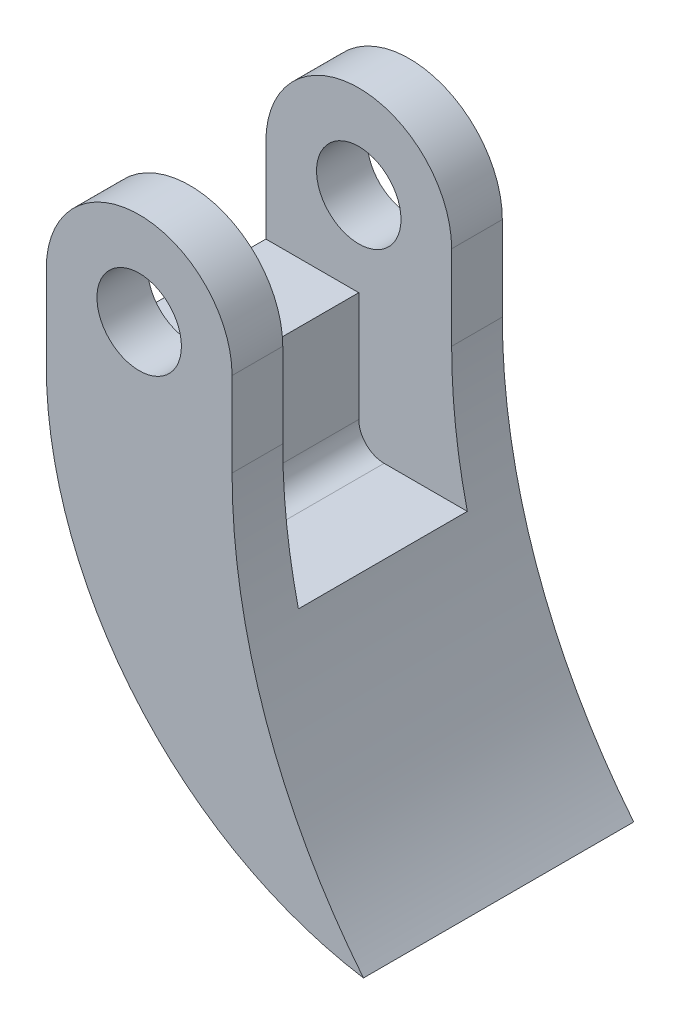
ISO-10303-21;
HEADER;
FILE_DESCRIPTION(('STEP AP214'),'2;1');
FILE_NAME('part.step','',(''),(''),'','','');
FILE_SCHEMA(('AUTOMOTIVE_DESIGN { 1 0 10303 214 1 1 1 1 }'));
ENDSEC;
DATA;
#1=APPLICATION_CONTEXT('core data for automotive mechanical design processes');
#2=APPLICATION_PROTOCOL_DEFINITION('international standard','automotive_design',2000,#1);
#3=PRODUCT_CONTEXT('',#1,'mechanical');
#4=PRODUCT('Part','Part','',(#3));
#5=PRODUCT_RELATED_PRODUCT_CATEGORY('part','',(#4));
#6=PRODUCT_DEFINITION_FORMATION('','',#4);
#7=PRODUCT_DEFINITION_CONTEXT('part definition',#1,'design');
#8=PRODUCT_DEFINITION('design','',#6,#7);
#9=PRODUCT_DEFINITION_SHAPE('','',#8);
#10=(LENGTH_UNIT() NAMED_UNIT(*) SI_UNIT(.MILLI.,.METRE.));
#11=(NAMED_UNIT(*) PLANE_ANGLE_UNIT() SI_UNIT($,.RADIAN.));
#12=(NAMED_UNIT(*) SI_UNIT($,.STERADIAN.) SOLID_ANGLE_UNIT());
#13=UNCERTAINTY_MEASURE_WITH_UNIT(LENGTH_MEASURE(1.E-05),#10,'distance_accuracy_value','');
#14=(GEOMETRIC_REPRESENTATION_CONTEXT(3) GLOBAL_UNCERTAINTY_ASSIGNED_CONTEXT((#13)) GLOBAL_UNIT_ASSIGNED_CONTEXT((#10,
#11,#12)) REPRESENTATION_CONTEXT('',''));
#15=CARTESIAN_POINT('',(0.,0.,0.));
#16=DIRECTION('',(0.,0.,1.));
#17=DIRECTION('',(1.,0.,0.));
#18=AXIS2_PLACEMENT_3D('',#15,#16,#17);
#19=CARTESIAN_POINT('',(1.33852066397794,67.0602,16.));
#20=DIRECTION('',(0.,0.,-1.));
#21=DIRECTION('',(-1.,0.,0.));
#22=AXIS2_PLACEMENT_3D('',#19,#20,#21);
#23=CYLINDRICAL_SURFACE('',#22,5.5);
#24=CARTESIAN_POINT('',(1.33852066397794,67.0602,3.));
#25=DIRECTION('',(0.,0.,-1.));
#26=DIRECTION('',(0.,1.,0.));
#27=AXIS2_PLACEMENT_3D('',#24,#25,#26);
#28=CIRCLE('',#27,5.5);
#29=CARTESIAN_POINT('',(-4.16147933602205,67.0602,3.));
#30=VERTEX_POINT('',#29);
#31=CARTESIAN_POINT('',(6.83852066397794,67.0602,3.));
#32=VERTEX_POINT('',#31);
#33=EDGE_CURVE('E164',#30,#32,#28,.T.);
#34=ORIENTED_EDGE('',*,*,#33,.T.);
#35=DIRECTION('',(0.,0.,-1.));
#36=VECTOR('',#35,1.);
#37=CARTESIAN_POINT('',(6.83852066397794,67.0602,16.));
#38=LINE('',#37,#36);
#39=CARTESIAN_POINT('',(6.83852066397794,67.0602,0.));
#40=VERTEX_POINT('',#39);
#41=EDGE_CURVE('E188',#32,#40,#38,.T.);
#42=ORIENTED_EDGE('',*,*,#41,.T.);
#43=CARTESIAN_POINT('',(1.33852066397794,67.0602,0.));
#44=DIRECTION('',(0.,0.,1.));
#45=DIRECTION('',(-1.,0.,0.));
#46=AXIS2_PLACEMENT_3D('',#43,#44,#45);
#47=CIRCLE('',#46,5.5);
#48=CARTESIAN_POINT('',(-4.16147933602205,67.0602,0.));
#49=VERTEX_POINT('',#48);
#50=EDGE_CURVE('E173',#40,#49,#47,.T.);
#51=ORIENTED_EDGE('',*,*,#50,.T.);
#52=DIRECTION('',(0.,0.,-1.));
#53=VECTOR('',#52,1.);
#54=CARTESIAN_POINT('',(-4.16147933602205,67.0602,16.));
#55=LINE('',#54,#53);
#56=EDGE_CURVE('E215',#30,#49,#55,.T.);
#57=ORIENTED_EDGE('',*,*,#56,.F.);
#58=EDGE_LOOP('',(#34,#42,#51,#57));
#59=FACE_BOUND('',#58,.T.);
#60=ADVANCED_FACE('F34',(#59),#23,.T.);
#61=CARTESIAN_POINT('',(-4.16147933602205,67.0602,16.));
#62=DIRECTION('',(1.,0.,0.));
#63=DIRECTION('',(0.,1.,0.));
#64=AXIS2_PLACEMENT_3D('',#61,#62,#63);
#65=PLANE('',#64);
#66=DIRECTION('',(0.,0.,-1.));
#67=VECTOR('',#66,1.);
#68=CARTESIAN_POINT('',(-4.16147933602205,62.0602,16.));
#69=LINE('',#68,#67);
#70=CARTESIAN_POINT('',(-4.16147933602205,62.0602000000007,3.));
#71=VERTEX_POINT('',#70);
#72=CARTESIAN_POINT('',(-4.16147933602205,62.0602,0.));
#73=VERTEX_POINT('',#72);
#74=EDGE_CURVE('E211',#71,#73,#69,.T.);
#75=ORIENTED_EDGE('',*,*,#74,.F.);
#76=DIRECTION('',(0.,1.,0.));
#77=VECTOR('',#76,1.);
#78=CARTESIAN_POINT('',(-4.16147933602205,67.0602,3.));
#79=LINE('',#78,#77);
#80=EDGE_CURVE('E147',#71,#30,#79,.T.);
#81=ORIENTED_EDGE('',*,*,#80,.T.);
#82=ORIENTED_EDGE('',*,*,#56,.T.);
#83=DIRECTION('',(0.,-1.,0.));
#84=VECTOR('',#83,1.);
#85=CARTESIAN_POINT('',(-4.16147933602205,67.0602,0.));
#86=LINE('',#85,#84);
#87=EDGE_CURVE('E191',#49,#73,#86,.T.);
#88=ORIENTED_EDGE('',*,*,#87,.T.);
#89=EDGE_LOOP('',(#75,#81,#82,#88));
#90=FACE_BOUND('',#89,.T.);
#91=ADVANCED_FACE('F258',(#90),#65,.F.);
#92=CARTESIAN_POINT('',(6.83852066397794,67.0602,16.));
#93=DIRECTION('',(-1.,0.,0.));
#94=DIRECTION('',(0.,-1.,0.));
#95=AXIS2_PLACEMENT_3D('',#92,#93,#94);
#96=PLANE('',#95);
#97=ORIENTED_EDGE('',*,*,#41,.F.);
#98=DIRECTION('',(0.,1.,0.));
#99=VECTOR('',#98,1.);
#100=CARTESIAN_POINT('',(6.83852066397795,62.0602000000007,3.));
#101=LINE('',#100,#99);
#102=CARTESIAN_POINT('',(6.83852066397794,62.0602000000007,3.));
#103=VERTEX_POINT('',#102);
#104=EDGE_CURVE('E153',#103,#32,#101,.T.);
#105=ORIENTED_EDGE('',*,*,#104,.F.);
#106=DIRECTION('',(0.,0.,-1.));
#107=VECTOR('',#106,1.);
#108=CARTESIAN_POINT('',(6.83852066397794,62.0602,16.));
#109=LINE('',#108,#107);
#110=CARTESIAN_POINT('',(6.83852066397794,62.0602,0.));
#111=VERTEX_POINT('',#110);
#112=EDGE_CURVE('E204',#103,#111,#109,.T.);
#113=ORIENTED_EDGE('',*,*,#112,.T.);
#114=DIRECTION('',(0.,1.,0.));
#115=VECTOR('',#114,1.);
#116=CARTESIAN_POINT('',(6.83852066397794,67.0602,0.));
#117=LINE('',#116,#115);
#118=EDGE_CURVE('E180',#111,#40,#117,.T.);
#119=ORIENTED_EDGE('',*,*,#118,.T.);
#120=EDGE_LOOP('',(#97,#105,#113,#119));
#121=FACE_BOUND('',#120,.T.);
#122=ADVANCED_FACE('F251',(#121),#96,.F.);
#123=CARTESIAN_POINT('',(1.33852066397794,67.0602,0.));
#124=DIRECTION('',(0.,0.,1.));
#125=DIRECTION('',(1.,0.,0.));
#126=AXIS2_PLACEMENT_3D('',#123,#124,#125);
#127=CYLINDRICAL_SURFACE('',#126,2.5);
#128=CARTESIAN_POINT('',(1.33852066397794,67.0602,3.));
#129=DIRECTION('',(0.,0.,-1.));
#130=DIRECTION('',(0.,1.,0.));
#131=AXIS2_PLACEMENT_3D('',#128,#129,#130);
#132=CIRCLE('',#131,2.5);
#133=CARTESIAN_POINT('',(1.33852066397794,69.5602,3.));
#134=VERTEX_POINT('',#133);
#135=EDGE_CURVE('E162',#134,#134,#132,.F.);
#136=ORIENTED_EDGE('',*,*,#135,.T.);
#137=EDGE_LOOP('',(#136));
#138=FACE_BOUND('',#137,.T.);
#139=CARTESIAN_POINT('',(1.33852066397794,67.0602,0.));
#140=DIRECTION('',(0.,0.,1.));
#141=DIRECTION('',(1.,0.,0.));
#142=AXIS2_PLACEMENT_3D('',#139,#140,#141);
#143=CIRCLE('',#142,2.5);
#144=CARTESIAN_POINT('',(3.83852066397795,67.0602,0.));
#145=VERTEX_POINT('',#144);
#146=EDGE_CURVE('E170',#145,#145,#143,.T.);
#147=ORIENTED_EDGE('',*,*,#146,.F.);
#148=EDGE_LOOP('',(#147));
#149=FACE_BOUND('',#148,.T.);
#150=ADVANCED_FACE('F292',(#138,#149),#127,.F.);
#151=CARTESIAN_POINT('',(6.83852066397794,67.0602,16.));
#152=VERTEX_POINT('',#151);
#153=CARTESIAN_POINT('',(6.83852066397794,67.0602,13.));
#154=VERTEX_POINT('',#153);
#155=EDGE_CURVE('E201',#152,#154,#38,.T.);
#156=ORIENTED_EDGE('',*,*,#155,.T.);
#157=CARTESIAN_POINT('',(1.33852066397794,67.0602,13.));
#158=DIRECTION('',(0.,0.,1.));
#159=DIRECTION('',(0.,-1.,0.));
#160=AXIS2_PLACEMENT_3D('',#157,#158,#159);
#161=CIRCLE('',#160,5.5);
#162=CARTESIAN_POINT('',(-4.16147933602205,67.0602,13.));
#163=VERTEX_POINT('',#162);
#164=EDGE_CURVE('E160',#154,#163,#161,.T.);
#165=ORIENTED_EDGE('',*,*,#164,.T.);
#166=CARTESIAN_POINT('',(-4.16147933602205,67.0602,16.));
#167=VERTEX_POINT('',#166);
#168=EDGE_CURVE('E216',#167,#163,#55,.T.);
#169=ORIENTED_EDGE('',*,*,#168,.F.);
#170=CARTESIAN_POINT('',(1.33852066397794,67.0602,16.));
#171=DIRECTION('',(0.,0.,1.));
#172=DIRECTION('',(-1.,0.,0.));
#173=AXIS2_PLACEMENT_3D('',#170,#171,#172);
#174=CIRCLE('',#173,5.5);
#175=EDGE_CURVE('E176',#152,#167,#174,.T.);
#176=ORIENTED_EDGE('',*,*,#175,.F.);
#177=EDGE_LOOP('',(#156,#165,#169,#176));
#178=FACE_BOUND('',#177,.T.);
#179=ADVANCED_FACE('F286',(#178),#23,.T.);
#180=ORIENTED_EDGE('',*,*,#168,.T.);
#181=DIRECTION('',(0.,-1.,0.));
#182=VECTOR('',#181,1.);
#183=CARTESIAN_POINT('',(-4.16147933602205,67.0602,13.));
#184=LINE('',#183,#182);
#185=CARTESIAN_POINT('',(-4.16147933602205,62.0602000000007,13.));
#186=VERTEX_POINT('',#185);
#187=EDGE_CURVE('E151',#163,#186,#184,.T.);
#188=ORIENTED_EDGE('',*,*,#187,.T.);
#189=CARTESIAN_POINT('',(-4.16147933602205,62.0602,16.));
#190=VERTEX_POINT('',#189);
#191=EDGE_CURVE('E212',#190,#186,#69,.T.);
#192=ORIENTED_EDGE('',*,*,#191,.F.);
#193=DIRECTION('',(0.,-1.,0.));
#194=VECTOR('',#193,1.);
#195=CARTESIAN_POINT('',(-4.16147933602205,67.0602,16.));
#196=LINE('',#195,#194);
#197=EDGE_CURVE('E179',#167,#190,#196,.T.);
#198=ORIENTED_EDGE('',*,*,#197,.F.);
#199=EDGE_LOOP('',(#180,#188,#192,#198));
#200=FACE_BOUND('',#199,.T.);
#201=ADVANCED_FACE('F277',(#200),#65,.F.);
#202=CARTESIAN_POINT('',(18.114814546425,62.0602,16.));
#203=DIRECTION('',(0.,0.,-1.));
#204=DIRECTION('',(-1.,0.,0.));
#205=AXIS2_PLACEMENT_3D('',#202,#203,#204);
#206=CYLINDRICAL_SURFACE('',#205,22.2762938824471);
#207=CARTESIAN_POINT('',(18.114814546425,62.0602,0.));
#208=DIRECTION('',(0.,0.,1.));
#209=DIRECTION('',(1.,0.,0.));
#210=AXIS2_PLACEMENT_3D('',#207,#208,#209);
#211=CIRCLE('',#210,22.2762938824471);
#212=CARTESIAN_POINT('',(14.6172054863455,40.0602,0.));
#213=VERTEX_POINT('',#212);
#214=EDGE_CURVE('E194',#73,#213,#211,.T.);
#215=ORIENTED_EDGE('',*,*,#214,.T.);
#216=DIRECTION('',(0.,0.,-1.));
#217=VECTOR('',#216,1.);
#218=CARTESIAN_POINT('',(14.6172054863455,40.0602,16.));
#219=LINE('',#218,#217);
#220=CARTESIAN_POINT('',(14.6172054863455,40.0602,16.));
#221=VERTEX_POINT('',#220);
#222=EDGE_CURVE('E208',#221,#213,#219,.T.);
#223=ORIENTED_EDGE('',*,*,#222,.F.);
#224=CARTESIAN_POINT('',(18.114814546425,62.0602,16.));
#225=DIRECTION('',(0.,0.,1.));
#226=DIRECTION('',(1.,0.,0.));
#227=AXIS2_PLACEMENT_3D('',#224,#225,#226);
#228=CIRCLE('',#227,22.2762938824471);
#229=EDGE_CURVE('E182',#190,#221,#228,.T.);
#230=ORIENTED_EDGE('',*,*,#229,.F.);
#231=ORIENTED_EDGE('',*,*,#191,.T.);
#232=DIRECTION('',(0.,0.,-1.));
#233=VECTOR('',#232,1.);
#234=CARTESIAN_POINT('',(-4.16147933602205,62.0602000000007,16.));
#235=LINE('',#234,#233);
#236=EDGE_CURVE('E166',#186,#71,#235,.T.);
#237=ORIENTED_EDGE('',*,*,#236,.T.);
#238=ORIENTED_EDGE('',*,*,#74,.T.);
#239=EDGE_LOOP('',(#215,#223,#230,#231,#237,#238));
#240=FACE_BOUND('',#239,.T.);
#241=ADVANCED_FACE('F265',(#240),#206,.T.);
#242=CARTESIAN_POINT('',(41.8385206639779,62.0602,16.));
#243=DIRECTION('',(0.,0.,-1.));
#244=DIRECTION('',(-1.,0.,0.));
#245=AXIS2_PLACEMENT_3D('',#242,#243,#244);
#246=CYLINDRICAL_SURFACE('',#245,35.);
#247=DIRECTION('',(0.,0.,-1.));
#248=VECTOR('',#247,1.);
#249=CARTESIAN_POINT('',(7.76507058917614,54.0602000000007,16.));
#250=LINE('',#249,#248);
#251=CARTESIAN_POINT('',(7.76507058917614,54.0602000000007,3.));
#252=VERTEX_POINT('',#251);
#253=CARTESIAN_POINT('',(7.76507058917614,54.0602000000007,13.));
#254=VERTEX_POINT('',#253);
#255=EDGE_CURVE('E218',#252,#254,#250,.F.);
#256=ORIENTED_EDGE('',*,*,#255,.T.);
#257=CARTESIAN_POINT('',(41.8385206639779,62.0602,13.));
#258=DIRECTION('',(0.,0.,1.));
#259=DIRECTION('',(1.,0.,0.));
#260=AXIS2_PLACEMENT_3D('',#257,#258,#259);
#261=CIRCLE('',#260,35.);
#262=CARTESIAN_POINT('',(6.83852066397794,62.0602000000007,13.));
#263=VERTEX_POINT('',#262);
#264=EDGE_CURVE('E236',#254,#263,#261,.F.);
#265=ORIENTED_EDGE('',*,*,#264,.T.);
#266=CARTESIAN_POINT('',(6.83852066397794,62.0602,16.));
#267=VERTEX_POINT('',#266);
#268=EDGE_CURVE('E205',#267,#263,#109,.T.);
#269=ORIENTED_EDGE('',*,*,#268,.F.);
#270=CARTESIAN_POINT('',(41.8385206639779,62.0602,16.));
#271=DIRECTION('',(0.,0.,-1.));
#272=DIRECTION('',(1.,0.,0.));
#273=AXIS2_PLACEMENT_3D('',#270,#271,#272);
#274=CIRCLE('',#273,35.);
#275=EDGE_CURVE('E184',#221,#267,#274,.T.);
#276=ORIENTED_EDGE('',*,*,#275,.F.);
#277=ORIENTED_EDGE('',*,*,#222,.T.);
#278=CARTESIAN_POINT('',(41.8385206639779,62.0602,0.));
#279=DIRECTION('',(0.,0.,-1.));
#280=DIRECTION('',(1.,0.,0.));
#281=AXIS2_PLACEMENT_3D('',#278,#279,#280);
#282=CIRCLE('',#281,35.);
#283=EDGE_CURVE('E196',#213,#111,#282,.T.);
#284=ORIENTED_EDGE('',*,*,#283,.T.);
#285=ORIENTED_EDGE('',*,*,#112,.F.);
#286=CARTESIAN_POINT('',(41.8385206639779,62.0602,3.));
#287=DIRECTION('',(0.,0.,-1.));
#288=DIRECTION('',(-1.,0.,0.));
#289=AXIS2_PLACEMENT_3D('',#286,#287,#288);
#290=CIRCLE('',#289,35.);
#291=EDGE_CURVE('E240',#103,#252,#290,.F.);
#292=ORIENTED_EDGE('',*,*,#291,.T.);
#293=EDGE_LOOP('',(#256,#265,#269,#276,#277,#284,#285,#292));
#294=FACE_BOUND('',#293,.T.);
#295=ADVANCED_FACE('F269',(#294),#246,.F.);
#296=ORIENTED_EDGE('',*,*,#268,.T.);
#297=DIRECTION('',(0.,-1.,0.));
#298=VECTOR('',#297,1.);
#299=CARTESIAN_POINT('',(6.83852066397794,72.5602,13.));
#300=LINE('',#299,#298);
#301=EDGE_CURVE('E244',#154,#263,#300,.T.);
#302=ORIENTED_EDGE('',*,*,#301,.F.);
#303=ORIENTED_EDGE('',*,*,#155,.F.);
#304=DIRECTION('',(0.,1.,0.));
#305=VECTOR('',#304,1.);
#306=CARTESIAN_POINT('',(6.83852066397794,67.0602,16.));
#307=LINE('',#306,#305);
#308=EDGE_CURVE('E186',#267,#152,#307,.T.);
#309=ORIENTED_EDGE('',*,*,#308,.F.);
#310=EDGE_LOOP('',(#296,#302,#303,#309));
#311=FACE_BOUND('',#310,.T.);
#312=ADVANCED_FACE('F303',(#311),#96,.F.);
#313=CARTESIAN_POINT('',(1.33852066397794,67.0602,16.));
#314=DIRECTION('',(0.,0.,-1.));
#315=DIRECTION('',(-1.,0.,0.));
#316=AXIS2_PLACEMENT_3D('',#313,#314,#315);
#317=PLANE('',#316);
#318=CARTESIAN_POINT('',(1.33852066397794,67.0602,16.));
#319=DIRECTION('',(0.,0.,1.));
#320=DIRECTION('',(1.,0.,0.));
#321=AXIS2_PLACEMENT_3D('',#318,#319,#320);
#322=CIRCLE('',#321,2.5);
#323=CARTESIAN_POINT('',(3.83852066397795,67.0602,16.));
#324=VERTEX_POINT('',#323);
#325=EDGE_CURVE('E169',#324,#324,#322,.T.);
#326=ORIENTED_EDGE('',*,*,#325,.F.);
#327=EDGE_LOOP('',(#326));
#328=FACE_BOUND('',#327,.T.);
#329=ORIENTED_EDGE('',*,*,#175,.T.);
#330=ORIENTED_EDGE('',*,*,#197,.T.);
#331=ORIENTED_EDGE('',*,*,#229,.T.);
#332=ORIENTED_EDGE('',*,*,#275,.T.);
#333=ORIENTED_EDGE('',*,*,#308,.T.);
#334=EDGE_LOOP('',(#329,#330,#331,#332,#333));
#335=FACE_BOUND('',#334,.T.);
#336=ADVANCED_FACE('F273',(#328,#335),#317,.F.);
#337=CARTESIAN_POINT('',(1.33852066397794,67.0602,0.));
#338=DIRECTION('',(0.,0.,-1.));
#339=DIRECTION('',(-1.,0.,0.));
#340=AXIS2_PLACEMENT_3D('',#337,#338,#339);
#341=PLANE('',#340);
#342=ORIENTED_EDGE('',*,*,#146,.T.);
#343=EDGE_LOOP('',(#342));
#344=FACE_BOUND('',#343,.T.);
#345=ORIENTED_EDGE('',*,*,#50,.F.);
#346=ORIENTED_EDGE('',*,*,#118,.F.);
#347=ORIENTED_EDGE('',*,*,#283,.F.);
#348=ORIENTED_EDGE('',*,*,#214,.F.);
#349=ORIENTED_EDGE('',*,*,#87,.F.);
#350=EDGE_LOOP('',(#345,#346,#347,#348,#349));
#351=FACE_BOUND('',#350,.T.);
#352=ADVANCED_FACE('F261',(#344,#351),#341,.T.);
#353=CARTESIAN_POINT('',(1.33852066397794,67.0602,13.));
#354=DIRECTION('',(0.,0.,1.));
#355=DIRECTION('',(0.,-1.,0.));
#356=AXIS2_PLACEMENT_3D('',#353,#354,#355);
#357=CIRCLE('',#356,2.5);
#358=CARTESIAN_POINT('',(1.33852066397794,64.5602,13.));
#359=VERTEX_POINT('',#358);
#360=EDGE_CURVE('E148',#359,#359,#357,.F.);
#361=ORIENTED_EDGE('',*,*,#360,.T.);
#362=EDGE_LOOP('',(#361));
#363=FACE_BOUND('',#362,.T.);
#364=ORIENTED_EDGE('',*,*,#325,.T.);
#365=EDGE_LOOP('',(#364));
#366=FACE_BOUND('',#365,.T.);
#367=ADVANCED_FACE('F300',(#363,#366),#127,.F.);
#368=CARTESIAN_POINT('',(-9.16147933602205,62.0602000000007,13.));
#369=DIRECTION('',(0.,-1.,0.));
#370=DIRECTION('',(1.,0.,0.));
#371=AXIS2_PLACEMENT_3D('',#368,#369,#370);
#372=PLANE('',#371);
#373=DIRECTION('',(1.,0.,0.));
#374=VECTOR('',#373,1.);
#375=CARTESIAN_POINT('',(-9.16147933602205,62.0602000000007,13.));
#376=LINE('',#375,#374);
#377=CARTESIAN_POINT('',(1.33852066397794,62.0602000000007,13.));
#378=VERTEX_POINT('',#377);
#379=EDGE_CURVE('E142',#186,#378,#376,.T.);
#380=ORIENTED_EDGE('',*,*,#379,.T.);
#381=DIRECTION('',(0.,0.,1.));
#382=VECTOR('',#381,1.);
#383=CARTESIAN_POINT('',(1.33852066397795,62.0602000000007,13.));
#384=LINE('',#383,#382);
#385=CARTESIAN_POINT('',(1.33852066397795,62.0602000000007,3.));
#386=VERTEX_POINT('',#385);
#387=EDGE_CURVE('E128',#386,#378,#384,.T.);
#388=ORIENTED_EDGE('',*,*,#387,.F.);
#389=DIRECTION('',(1.,0.,0.));
#390=VECTOR('',#389,1.);
#391=CARTESIAN_POINT('',(-9.16147933602205,62.0602000000007,3.));
#392=LINE('',#391,#390);
#393=EDGE_CURVE('E139',#71,#386,#392,.T.);
#394=ORIENTED_EDGE('',*,*,#393,.F.);
#395=ORIENTED_EDGE('',*,*,#236,.F.);
#396=EDGE_LOOP('',(#380,#388,#394,#395));
#397=FACE_BOUND('',#396,.T.);
#398=ADVANCED_FACE('F138',(#397),#372,.F.);
#399=CARTESIAN_POINT('',(-9.16147933602205,62.0602000000007,3.));
#400=DIRECTION('',(0.,0.,-1.));
#401=DIRECTION('',(0.,1.,0.));
#402=AXIS2_PLACEMENT_3D('',#399,#400,#401);
#403=PLANE('',#402);
#404=ORIENTED_EDGE('',*,*,#135,.F.);
#405=EDGE_LOOP('',(#404));
#406=FACE_BOUND('',#405,.T.);
#407=DIRECTION('',(0.,1.,0.));
#408=VECTOR('',#407,1.);
#409=CARTESIAN_POINT('',(1.33852066397795,54.0602000000007,3.));
#410=LINE('',#409,#408);
#411=CARTESIAN_POINT('',(1.33852066397795,55.5602000000007,3.));
#412=VERTEX_POINT('',#411);
#413=EDGE_CURVE('E125',#412,#386,#410,.T.);
#414=ORIENTED_EDGE('',*,*,#413,.F.);
#415=CARTESIAN_POINT('',(2.83852066397795,55.5602000000007,3.));
#416=DIRECTION('',(0.,0.,-1.));
#417=DIRECTION('',(0.,1.,0.));
#418=AXIS2_PLACEMENT_3D('',#415,#416,#417);
#419=CIRCLE('',#418,1.5);
#420=CARTESIAN_POINT('',(2.83852066397795,54.0602000000007,3.));
#421=VERTEX_POINT('',#420);
#422=EDGE_CURVE('E11',#412,#421,#419,.F.);
#423=ORIENTED_EDGE('',*,*,#422,.T.);
#424=DIRECTION('',(-1.,0.,0.));
#425=VECTOR('',#424,1.);
#426=CARTESIAN_POINT('',(1.33852066397795,54.0602000000007,3.));
#427=LINE('',#426,#425);
#428=EDGE_CURVE('E143',#252,#421,#427,.T.);
#429=ORIENTED_EDGE('',*,*,#428,.F.);
#430=ORIENTED_EDGE('',*,*,#291,.F.);
#431=ORIENTED_EDGE('',*,*,#104,.T.);
#432=ORIENTED_EDGE('',*,*,#33,.F.);
#433=ORIENTED_EDGE('',*,*,#80,.F.);
#434=ORIENTED_EDGE('',*,*,#393,.T.);
#435=EDGE_LOOP('',(#414,#423,#429,#430,#431,#432,#433,#434));
#436=FACE_BOUND('',#435,.T.);
#437=ADVANCED_FACE('F145',(#406,#436),#403,.F.);
#438=CARTESIAN_POINT('',(-9.16147933602206,72.5602,13.));
#439=DIRECTION('',(0.,0.,1.));
#440=DIRECTION('',(0.,-1.,0.));
#441=AXIS2_PLACEMENT_3D('',#438,#439,#440);
#442=PLANE('',#441);
#443=ORIENTED_EDGE('',*,*,#360,.F.);
#444=EDGE_LOOP('',(#443));
#445=FACE_BOUND('',#444,.T.);
#446=DIRECTION('',(1.,0.,0.));
#447=VECTOR('',#446,1.);
#448=CARTESIAN_POINT('',(8.33852066397795,54.0602000000007,13.));
#449=LINE('',#448,#447);
#450=CARTESIAN_POINT('',(2.83852066397795,54.0602000000007,13.));
#451=VERTEX_POINT('',#450);
#452=EDGE_CURVE('E134',#451,#254,#449,.T.);
#453=ORIENTED_EDGE('',*,*,#452,.F.);
#454=CARTESIAN_POINT('',(2.83852066397795,55.5602000000007,13.));
#455=DIRECTION('',(0.,0.,1.));
#456=DIRECTION('',(0.,-1.,0.));
#457=AXIS2_PLACEMENT_3D('',#454,#455,#456);
#458=CIRCLE('',#457,1.5);
#459=CARTESIAN_POINT('',(1.33852066397795,55.5602000000007,13.));
#460=VERTEX_POINT('',#459);
#461=EDGE_CURVE('E56',#451,#460,#458,.F.);
#462=ORIENTED_EDGE('',*,*,#461,.T.);
#463=DIRECTION('',(0.,1.,0.));
#464=VECTOR('',#463,1.);
#465=CARTESIAN_POINT('',(1.33852066397795,54.0602000000007,13.));
#466=LINE('',#465,#464);
#467=EDGE_CURVE('E133',#460,#378,#466,.T.);
#468=ORIENTED_EDGE('',*,*,#467,.T.);
#469=ORIENTED_EDGE('',*,*,#379,.F.);
#470=ORIENTED_EDGE('',*,*,#187,.F.);
#471=ORIENTED_EDGE('',*,*,#164,.F.);
#472=ORIENTED_EDGE('',*,*,#301,.T.);
#473=ORIENTED_EDGE('',*,*,#264,.F.);
#474=EDGE_LOOP('',(#453,#462,#468,#469,#470,#471,#472,#473));
#475=FACE_BOUND('',#474,.T.);
#476=ADVANCED_FACE('F234',(#445,#475),#442,.F.);
#477=CARTESIAN_POINT('',(0.,54.0602000000007,0.));
#478=DIRECTION('',(0.,-1.,0.));
#479=DIRECTION('',(0.,0.,-1.));
#480=AXIS2_PLACEMENT_3D('',#477,#478,#479);
#481=PLANE('',#480);
#482=ORIENTED_EDGE('',*,*,#428,.T.);
#483=DIRECTION('',(0.,0.,1.));
#484=VECTOR('',#483,1.);
#485=CARTESIAN_POINT('',(2.83852066397795,54.0602000000007,13.));
#486=LINE('',#485,#484);
#487=EDGE_CURVE('E224',#421,#451,#486,.T.);
#488=ORIENTED_EDGE('',*,*,#487,.T.);
#489=ORIENTED_EDGE('',*,*,#452,.T.);
#490=ORIENTED_EDGE('',*,*,#255,.F.);
#491=EDGE_LOOP('',(#482,#488,#489,#490));
#492=FACE_BOUND('',#491,.T.);
#493=ADVANCED_FACE('F230',(#492),#481,.F.);
#494=CARTESIAN_POINT('',(1.33852066397795,54.0602000000007,13.));
#495=DIRECTION('',(-1.,0.,0.));
#496=DIRECTION('',(0.,-1.,0.));
#497=AXIS2_PLACEMENT_3D('',#494,#495,#496);
#498=PLANE('',#497);
#499=ORIENTED_EDGE('',*,*,#467,.F.);
#500=DIRECTION('',(0.,0.,1.));
#501=VECTOR('',#500,1.);
#502=CARTESIAN_POINT('',(1.33852066397795,55.5602000000007,3.));
#503=LINE('',#502,#501);
#504=EDGE_CURVE('E42',#460,#412,#503,.F.);
#505=ORIENTED_EDGE('',*,*,#504,.T.);
#506=ORIENTED_EDGE('',*,*,#413,.T.);
#507=ORIENTED_EDGE('',*,*,#387,.T.);
#508=EDGE_LOOP('',(#499,#505,#506,#507));
#509=FACE_BOUND('',#508,.T.);
#510=ADVANCED_FACE('F127',(#509),#498,.F.);
#511=CARTESIAN_POINT('',(2.83852066397795,55.5602000000007,0.));
#512=DIRECTION('',(0.,0.,-1.));
#513=DIRECTION('',(-1.,0.,0.));
#514=AXIS2_PLACEMENT_3D('',#511,#512,#513);
#515=CYLINDRICAL_SURFACE('',#514,1.5);
#516=ORIENTED_EDGE('',*,*,#422,.F.);
#517=ORIENTED_EDGE('',*,*,#504,.F.);
#518=ORIENTED_EDGE('',*,*,#461,.F.);
#519=ORIENTED_EDGE('',*,*,#487,.F.);
#520=EDGE_LOOP('',(#516,#517,#518,#519));
#521=FACE_BOUND('',#520,.T.);
#522=ADVANCED_FACE('F36',(#521),#515,.F.);
#523=CLOSED_SHELL('',(#60,#91,#122,#150,#179,#201,#241,#295,#312,#336,#352,#367,#398,#437,#476,
#493,#510,#522));
#524=MANIFOLD_SOLID_BREP('B2',#523);
#525=ADVANCED_BREP_SHAPE_REPRESENTATION('',(#18,#524),#14);
#526=SHAPE_DEFINITION_REPRESENTATION(#9,#525);
ENDSEC;
END-ISO-10303-21;
